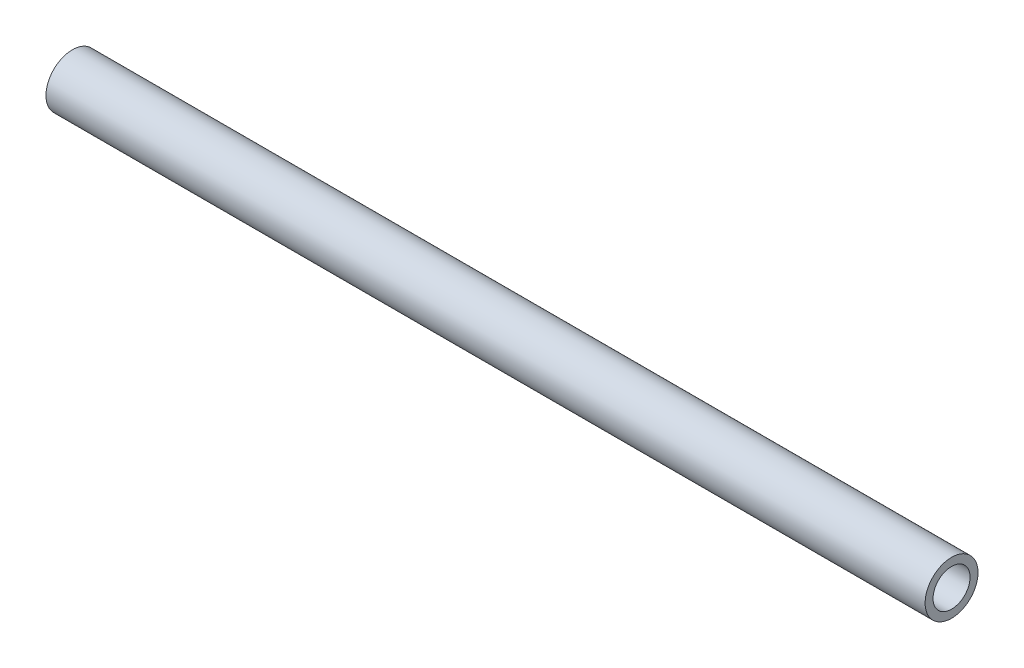
ISO-10303-21;
HEADER;
FILE_DESCRIPTION(('STEP AP214'),'2;1');
FILE_NAME('part.step','',(''),(''),'','','');
FILE_SCHEMA(('AUTOMOTIVE_DESIGN { 1 0 10303 214 1 1 1 1 }'));
ENDSEC;
DATA;
#1=APPLICATION_CONTEXT('core data for automotive mechanical design processes');
#2=APPLICATION_PROTOCOL_DEFINITION('international standard','automotive_design',2000,#1);
#3=PRODUCT_CONTEXT('',#1,'mechanical');
#4=PRODUCT('Part','Part','',(#3));
#5=PRODUCT_RELATED_PRODUCT_CATEGORY('part','',(#4));
#6=PRODUCT_DEFINITION_FORMATION('','',#4);
#7=PRODUCT_DEFINITION_CONTEXT('part definition',#1,'design');
#8=PRODUCT_DEFINITION('design','',#6,#7);
#9=PRODUCT_DEFINITION_SHAPE('','',#8);
#10=(LENGTH_UNIT() NAMED_UNIT(*) SI_UNIT(.MILLI.,.METRE.));
#11=(NAMED_UNIT(*) PLANE_ANGLE_UNIT() SI_UNIT($,.RADIAN.));
#12=(NAMED_UNIT(*) SI_UNIT($,.STERADIAN.) SOLID_ANGLE_UNIT());
#13=UNCERTAINTY_MEASURE_WITH_UNIT(LENGTH_MEASURE(1.E-05),#10,'distance_accuracy_value','');
#14=(GEOMETRIC_REPRESENTATION_CONTEXT(3) GLOBAL_UNCERTAINTY_ASSIGNED_CONTEXT((#13)) GLOBAL_UNIT_ASSIGNED_CONTEXT((#10,
#11,#12)) REPRESENTATION_CONTEXT('',''));
#15=CARTESIAN_POINT('',(0.,0.,0.));
#16=DIRECTION('',(0.,0.,1.));
#17=DIRECTION('',(1.,0.,0.));
#18=AXIS2_PLACEMENT_3D('',#15,#16,#17);
#19=CARTESIAN_POINT('',(166.21351899,6.99999999999995,0.));
#20=DIRECTION('',(1.,0.,0.));
#21=DIRECTION('',(0.,0.,-1.));
#22=AXIS2_PLACEMENT_3D('',#19,#20,#21);
#23=PLANE('',#22);
#24=CARTESIAN_POINT('',(166.21351899,0.,0.));
#25=DIRECTION('',(1.,0.,0.));
#26=DIRECTION('',(0.,0.,-1.));
#27=AXIS2_PLACEMENT_3D('',#24,#25,#26);
#28=CIRCLE('',#27,9.99999999999995);
#29=CARTESIAN_POINT('',(166.21351899,0.,-9.99999999999995));
#30=VERTEX_POINT('',#29);
#31=EDGE_CURVE('E45',#30,#30,#28,.T.);
#32=ORIENTED_EDGE('',*,*,#31,.T.);
#33=EDGE_LOOP('',(#32));
#34=FACE_BOUND('',#33,.T.);
#35=CARTESIAN_POINT('',(166.21351899,0.,0.));
#36=DIRECTION('',(1.,0.,0.));
#37=DIRECTION('',(0.,0.,-1.));
#38=AXIS2_PLACEMENT_3D('',#35,#36,#37);
#39=CIRCLE('',#38,6.99999999999995);
#40=CARTESIAN_POINT('',(166.21351899,0.,-6.99999999999995));
#41=VERTEX_POINT('',#40);
#42=EDGE_CURVE('E10',#41,#41,#39,.T.);
#43=ORIENTED_EDGE('',*,*,#42,.F.);
#44=EDGE_LOOP('',(#43));
#45=FACE_BOUND('',#44,.T.);
#46=ADVANCED_FACE('F31',(#34,#45),#23,.T.);
#47=CARTESIAN_POINT('',(265.225,0.,0.));
#48=DIRECTION('',(1.,0.,0.));
#49=DIRECTION('',(0.,0.,-1.));
#50=AXIS2_PLACEMENT_3D('',#47,#48,#49);
#51=CYLINDRICAL_SURFACE('',#50,6.99999999999995);
#52=ORIENTED_EDGE('',*,*,#42,.T.);
#53=EDGE_LOOP('',(#52));
#54=FACE_BOUND('',#53,.T.);
#55=CARTESIAN_POINT('',(-166.21351899,0.,0.));
#56=DIRECTION('',(1.,0.,0.));
#57=DIRECTION('',(0.,0.,-1.));
#58=AXIS2_PLACEMENT_3D('',#55,#56,#57);
#59=CIRCLE('',#58,6.99999999999995);
#60=CARTESIAN_POINT('',(-166.21351899,0.,-6.99999999999995));
#61=VERTEX_POINT('',#60);
#62=EDGE_CURVE('E37',#61,#61,#59,.T.);
#63=ORIENTED_EDGE('',*,*,#62,.F.);
#64=EDGE_LOOP('',(#63));
#65=FACE_BOUND('',#64,.T.);
#66=ADVANCED_FACE('F61',(#54,#65),#51,.F.);
#67=CARTESIAN_POINT('',(-166.21351899,9.99999999999995,0.));
#68=DIRECTION('',(-1.,0.,0.));
#69=DIRECTION('',(0.,0.,1.));
#70=AXIS2_PLACEMENT_3D('',#67,#68,#69);
#71=PLANE('',#70);
#72=ORIENTED_EDGE('',*,*,#62,.T.);
#73=EDGE_LOOP('',(#72));
#74=FACE_BOUND('',#73,.T.);
#75=CARTESIAN_POINT('',(-166.21351899,0.,0.));
#76=DIRECTION('',(1.,0.,0.));
#77=DIRECTION('',(0.,0.,-1.));
#78=AXIS2_PLACEMENT_3D('',#75,#76,#77);
#79=CIRCLE('',#78,9.99999999999995);
#80=CARTESIAN_POINT('',(-166.21351899,0.,-9.99999999999995));
#81=VERTEX_POINT('',#80);
#82=EDGE_CURVE('E41',#81,#81,#79,.T.);
#83=ORIENTED_EDGE('',*,*,#82,.F.);
#84=EDGE_LOOP('',(#83));
#85=FACE_BOUND('',#84,.T.);
#86=ADVANCED_FACE('F55',(#74,#85),#71,.T.);
#87=CARTESIAN_POINT('',(265.225,0.,0.));
#88=DIRECTION('',(1.,0.,0.));
#89=DIRECTION('',(0.,0.,-1.));
#90=AXIS2_PLACEMENT_3D('',#87,#88,#89);
#91=CYLINDRICAL_SURFACE('',#90,9.99999999999995);
#92=ORIENTED_EDGE('',*,*,#82,.T.);
#93=EDGE_LOOP('',(#92));
#94=FACE_BOUND('',#93,.T.);
#95=ORIENTED_EDGE('',*,*,#31,.F.);
#96=EDGE_LOOP('',(#95));
#97=FACE_BOUND('',#96,.T.);
#98=ADVANCED_FACE('F53',(#94,#97),#91,.T.);
#99=CLOSED_SHELL('',(#46,#66,#86,#98));
#100=MANIFOLD_SOLID_BREP('B2',#99);
#101=ADVANCED_BREP_SHAPE_REPRESENTATION('',(#18,#100),#14);
#102=SHAPE_DEFINITION_REPRESENTATION(#9,#101);
ENDSEC;
END-ISO-10303-21;
